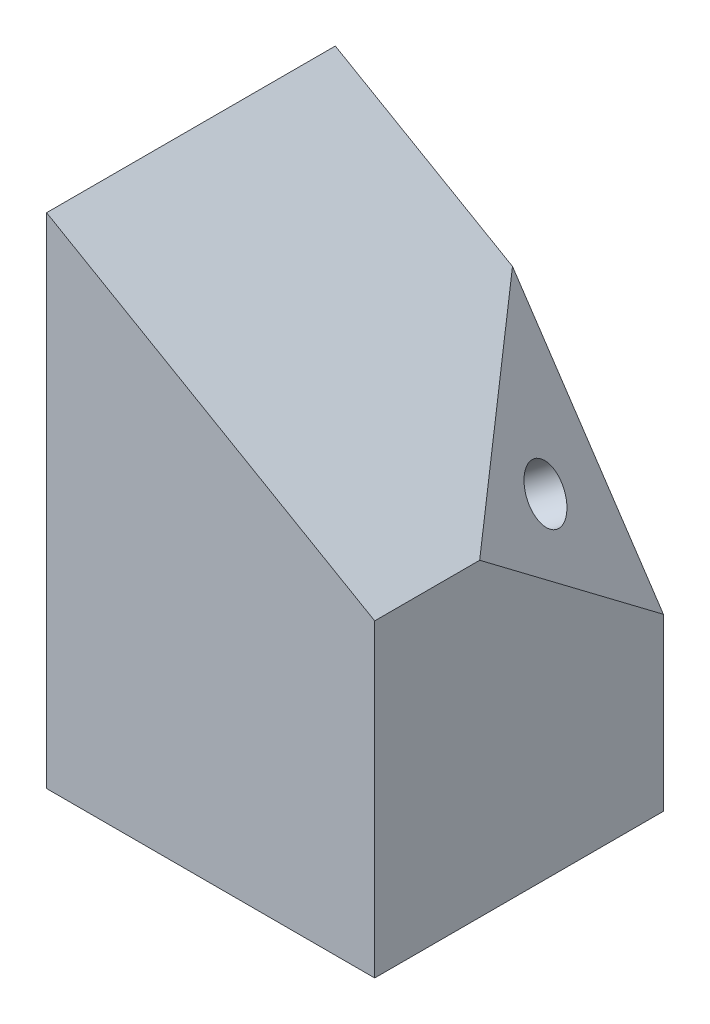
ISO-10303-21;
HEADER;
FILE_DESCRIPTION(('STEP AP214'),'2;1');
FILE_NAME('part.step','',(''),(''),'','','');
FILE_SCHEMA(('AUTOMOTIVE_DESIGN { 1 0 10303 214 1 1 1 1 }'));
ENDSEC;
DATA;
#1=APPLICATION_CONTEXT('core data for automotive mechanical design processes');
#2=APPLICATION_PROTOCOL_DEFINITION('international standard','automotive_design',2000,#1);
#3=PRODUCT_CONTEXT('',#1,'mechanical');
#4=PRODUCT('Part','Part','',(#3));
#5=PRODUCT_RELATED_PRODUCT_CATEGORY('part','',(#4));
#6=PRODUCT_DEFINITION_FORMATION('','',#4);
#7=PRODUCT_DEFINITION_CONTEXT('part definition',#1,'design');
#8=PRODUCT_DEFINITION('design','',#6,#7);
#9=PRODUCT_DEFINITION_SHAPE('','',#8);
#10=(LENGTH_UNIT() NAMED_UNIT(*) SI_UNIT(.MILLI.,.METRE.));
#11=(NAMED_UNIT(*) PLANE_ANGLE_UNIT() SI_UNIT($,.RADIAN.));
#12=(NAMED_UNIT(*) SI_UNIT($,.STERADIAN.) SOLID_ANGLE_UNIT());
#13=UNCERTAINTY_MEASURE_WITH_UNIT(LENGTH_MEASURE(1.E-05),#10,'distance_accuracy_value','');
#14=(GEOMETRIC_REPRESENTATION_CONTEXT(3) GLOBAL_UNCERTAINTY_ASSIGNED_CONTEXT((#13)) GLOBAL_UNIT_ASSIGNED_CONTEXT((#10,
#11,#12)) REPRESENTATION_CONTEXT('',''));
#15=CARTESIAN_POINT('',(0.,0.,0.));
#16=DIRECTION('',(0.,0.,1.));
#17=DIRECTION('',(1.,0.,0.));
#18=AXIS2_PLACEMENT_3D('',#15,#16,#17);
#19=CARTESIAN_POINT('',(-50.,76.,0.));
#20=DIRECTION('',(1.,0.,0.));
#21=DIRECTION('',(0.,0.,-1.));
#22=AXIS2_PLACEMENT_3D('',#19,#20,#21);
#23=PLANE('',#22);
#24=DIRECTION('',(0.,0.,1.));
#25=VECTOR('',#24,1.);
#26=CARTESIAN_POINT('',(-50.,0.,0.));
#27=LINE('',#26,#25);
#28=CARTESIAN_POINT('',(-50.,0.,-44.));
#29=VERTEX_POINT('',#28);
#30=CARTESIAN_POINT('',(-50.,0.,0.));
#31=VERTEX_POINT('',#30);
#32=EDGE_CURVE('E95',#29,#31,#27,.T.);
#33=ORIENTED_EDGE('',*,*,#32,.T.);
#34=DIRECTION('',(0.,-1.,0.));
#35=VECTOR('',#34,1.);
#36=CARTESIAN_POINT('',(-50.,76.,0.));
#37=LINE('',#36,#35);
#38=CARTESIAN_POINT('',(-50.,76.,0.));
#39=VERTEX_POINT('',#38);
#40=EDGE_CURVE('E11',#39,#31,#37,.T.);
#41=ORIENTED_EDGE('',*,*,#40,.F.);
#42=DIRECTION('',(0.,0.,1.));
#43=VECTOR('',#42,1.);
#44=CARTESIAN_POINT('',(-50.,76.,0.));
#45=LINE('',#44,#43);
#46=CARTESIAN_POINT('',(-50.,76.,-44.));
#47=VERTEX_POINT('',#46);
#48=EDGE_CURVE('E96',#47,#39,#45,.T.);
#49=ORIENTED_EDGE('',*,*,#48,.F.);
#50=DIRECTION('',(0.,-1.,0.));
#51=VECTOR('',#50,1.);
#52=CARTESIAN_POINT('',(-50.,76.,-44.));
#53=LINE('',#52,#51);
#54=EDGE_CURVE('E81',#47,#29,#53,.T.);
#55=ORIENTED_EDGE('',*,*,#54,.T.);
#56=EDGE_LOOP('',(#33,#41,#49,#55));
#57=FACE_BOUND('',#56,.T.);
#58=ADVANCED_FACE('F33',(#57),#23,.F.);
#59=CARTESIAN_POINT('',(-50.,76.,0.));
#60=DIRECTION('',(0.,0.,-1.));
#61=DIRECTION('',(-1.,0.,0.));
#62=AXIS2_PLACEMENT_3D('',#59,#60,#61);
#63=PLANE('',#62);
#64=DIRECTION('',(0.,-1.,0.));
#65=VECTOR('',#64,1.);
#66=CARTESIAN_POINT('',(0.,76.,0.));
#67=LINE('',#66,#65);
#68=CARTESIAN_POINT('',(0.,47.1324865405186,0.));
#69=VERTEX_POINT('',#68);
#70=CARTESIAN_POINT('',(0.,0.,0.));
#71=VERTEX_POINT('',#70);
#72=EDGE_CURVE('E40',#69,#71,#67,.T.);
#73=ORIENTED_EDGE('',*,*,#72,.F.);
#74=DIRECTION('',(0.866025403784438,-0.500000000000001,0.));
#75=VECTOR('',#74,1.);
#76=CARTESIAN_POINT('',(-50.,76.,0.));
#77=LINE('',#76,#75);
#78=EDGE_CURVE('E107',#39,#69,#77,.T.);
#79=ORIENTED_EDGE('',*,*,#78,.F.);
#80=ORIENTED_EDGE('',*,*,#40,.T.);
#81=DIRECTION('',(1.,0.,0.));
#82=VECTOR('',#81,1.);
#83=CARTESIAN_POINT('',(-50.,0.,0.));
#84=LINE('',#83,#82);
#85=EDGE_CURVE('E90',#31,#71,#84,.T.);
#86=ORIENTED_EDGE('',*,*,#85,.T.);
#87=EDGE_LOOP('',(#73,#79,#80,#86));
#88=FACE_BOUND('',#87,.T.);
#89=ADVANCED_FACE('F111',(#88),#63,.F.);
#90=CARTESIAN_POINT('',(0.,76.,0.));
#91=DIRECTION('',(-1.,0.,0.));
#92=DIRECTION('',(0.,0.,1.));
#93=AXIS2_PLACEMENT_3D('',#90,#91,#92);
#94=PLANE('',#93);
#95=DIRECTION('',(0.,-1.,0.));
#96=VECTOR('',#95,1.);
#97=CARTESIAN_POINT('',(0.,76.,-44.));
#98=LINE('',#97,#96);
#99=CARTESIAN_POINT('',(0.,26.,-44.));
#100=VERTEX_POINT('',#99);
#101=CARTESIAN_POINT('',(0.,0.,-44.));
#102=VERTEX_POINT('',#101);
#103=EDGE_CURVE('E72',#100,#102,#98,.T.);
#104=ORIENTED_EDGE('',*,*,#103,.F.);
#105=DIRECTION('',(0.,0.602414371591813,0.798183515803002));
#106=VECTOR('',#105,1.);
#107=CARTESIAN_POINT('',(0.,26.,-44.));
#108=LINE('',#107,#106);
#109=CARTESIAN_POINT('',(0.,47.1324865405186,-16.));
#110=VERTEX_POINT('',#109);
#111=EDGE_CURVE('E120',#100,#110,#108,.T.);
#112=ORIENTED_EDGE('',*,*,#111,.T.);
#113=DIRECTION('',(0.,0.,1.));
#114=VECTOR('',#113,1.);
#115=CARTESIAN_POINT('',(0.,47.1324865405186,-76.));
#116=LINE('',#115,#114);
#117=EDGE_CURVE('E104',#110,#69,#116,.T.);
#118=ORIENTED_EDGE('',*,*,#117,.T.);
#119=ORIENTED_EDGE('',*,*,#72,.T.);
#120=DIRECTION('',(0.,0.,-1.));
#121=VECTOR('',#120,1.);
#122=CARTESIAN_POINT('',(0.,0.,0.));
#123=LINE('',#122,#121);
#124=EDGE_CURVE('E84',#71,#102,#123,.T.);
#125=ORIENTED_EDGE('',*,*,#124,.T.);
#126=EDGE_LOOP('',(#104,#112,#118,#119,#125));
#127=FACE_BOUND('',#126,.T.);
#128=ADVANCED_FACE('F85',(#127),#94,.F.);
#129=CARTESIAN_POINT('',(-50.,76.,-44.));
#130=DIRECTION('',(0.,0.,1.));
#131=DIRECTION('',(1.,0.,0.));
#132=AXIS2_PLACEMENT_3D('',#129,#130,#131);
#133=PLANE('',#132);
#134=DIRECTION('',(0.866025403784438,-0.500000000000001,0.));
#135=VECTOR('',#134,1.);
#136=CARTESIAN_POINT('',(-50.,76.,-44.));
#137=LINE('',#136,#135);
#138=CARTESIAN_POINT('',(-23.,60.4115427318801,-44.));
#139=VERTEX_POINT('',#138);
#140=EDGE_CURVE('E55',#47,#139,#137,.T.);
#141=ORIENTED_EDGE('',*,*,#140,.T.);
#142=DIRECTION('',(0.555686184009288,-0.831392124632652,0.));
#143=VECTOR('',#142,1.);
#144=CARTESIAN_POINT('',(-23.,60.4115427318801,-44.));
#145=LINE('',#144,#143);
#146=EDGE_CURVE('E47',#139,#100,#145,.T.);
#147=ORIENTED_EDGE('',*,*,#146,.T.);
#148=ORIENTED_EDGE('',*,*,#103,.T.);
#149=DIRECTION('',(-1.,0.,0.));
#150=VECTOR('',#149,1.);
#151=CARTESIAN_POINT('',(-50.,0.,-44.));
#152=LINE('',#151,#150);
#153=EDGE_CURVE('E76',#102,#29,#152,.T.);
#154=ORIENTED_EDGE('',*,*,#153,.T.);
#155=ORIENTED_EDGE('',*,*,#54,.F.);
#156=EDGE_LOOP('',(#141,#147,#148,#154,#155));
#157=FACE_BOUND('',#156,.T.);
#158=ADVANCED_FACE('F74',(#157),#133,.F.);
#159=CARTESIAN_POINT('',(0.,0.,0.));
#160=DIRECTION('',(0.,-1.,0.));
#161=DIRECTION('',(0.,0.,-1.));
#162=AXIS2_PLACEMENT_3D('',#159,#160,#161);
#163=PLANE('',#162);
#164=ORIENTED_EDGE('',*,*,#32,.F.);
#165=ORIENTED_EDGE('',*,*,#153,.F.);
#166=ORIENTED_EDGE('',*,*,#124,.F.);
#167=ORIENTED_EDGE('',*,*,#85,.F.);
#168=EDGE_LOOP('',(#164,#165,#166,#167));
#169=FACE_BOUND('',#168,.T.);
#170=ADVANCED_FACE('F93',(#169),#163,.T.);
#171=CARTESIAN_POINT('',(-50.,76.,-76.));
#172=DIRECTION('',(-0.500000000000001,-0.866025403784438,0.));
#173=DIRECTION('',(0.866025403784438,-0.500000000000001,0.));
#174=AXIS2_PLACEMENT_3D('',#171,#172,#173);
#175=PLANE('',#174);
#176=ORIENTED_EDGE('',*,*,#117,.F.);
#177=DIRECTION('',(-0.59598026800957,0.344089368167032,-0.725541195837737));
#178=VECTOR('',#177,1.);
#179=CARTESIAN_POINT('',(0.,47.1324865405186,-16.));
#180=LINE('',#179,#178);
#181=EDGE_CURVE('E118',#110,#139,#180,.T.);
#182=ORIENTED_EDGE('',*,*,#181,.T.);
#183=ORIENTED_EDGE('',*,*,#140,.F.);
#184=ORIENTED_EDGE('',*,*,#48,.T.);
#185=ORIENTED_EDGE('',*,*,#78,.T.);
#186=EDGE_LOOP('',(#176,#182,#183,#184,#185));
#187=FACE_BOUND('',#186,.T.);
#188=ADVANCED_FACE('F125',(#187),#175,.F.);
#189=CARTESIAN_POINT('',(23.2621653949621,15.5479749412239,-11.7345489706334));
#190=DIRECTION('',(-0.76669444974503,-0.512443527496922,0.386757355271592));
#191=DIRECTION('',(0.555686184009289,-0.831392124632652,0.));
#192=AXIS2_PLACEMENT_3D('',#189,#190,#191);
#193=PLANE('',#192);
#194=CARTESIAN_POINT('',(-6.4871794871795,44.3755578127943,-32.5128205128205));
#195=DIRECTION('',(-0.76669444974503,-0.512443527496922,0.386757355271592));
#196=DIRECTION('',(0.555686184009288,-0.831392124632652,0.));
#197=AXIS2_PLACEMENT_3D('',#194,#195,#196);
#198=CIRCLE('',#197,4.00000000000001);
#199=CARTESIAN_POINT('',(-4.26443475114234,41.0499893142637,-32.5128205128205));
#200=VERTEX_POINT('',#199);
#201=EDGE_CURVE('E128',#200,#200,#198,.T.);
#202=ORIENTED_EDGE('',*,*,#201,.T.);
#203=EDGE_LOOP('',(#202));
#204=FACE_BOUND('',#203,.T.);
#205=ORIENTED_EDGE('',*,*,#111,.F.);
#206=ORIENTED_EDGE('',*,*,#146,.F.);
#207=ORIENTED_EDGE('',*,*,#181,.F.);
#208=EDGE_LOOP('',(#205,#206,#207));
#209=FACE_BOUND('',#208,.T.);
#210=ADVANCED_FACE('F119',(#204,#209),#193,.F.);
#211=CARTESIAN_POINT('',(-21.8210684820801,34.1266872628559,-24.7776734073887));
#212=DIRECTION('',(0.76669444974503,0.512443527496922,-0.386757355271592));
#213=DIRECTION('',(-0.555686184009288,0.831392124632652,0.));
#214=AXIS2_PLACEMENT_3D('',#211,#212,#213);
#215=CYLINDRICAL_SURFACE('',#214,4.00000000000001);
#216=CARTESIAN_POINT('',(-21.8210684820801,34.1266872628559,-24.7776734073887));
#217=DIRECTION('',(-0.76669444974503,-0.512443527496922,0.386757355271592));
#218=DIRECTION('',(0.555686184009288,-0.831392124632652,0.));
#219=AXIS2_PLACEMENT_3D('',#216,#217,#218);
#220=CIRCLE('',#219,4.00000000000001);
#221=CARTESIAN_POINT('',(-19.5983237460429,30.8011187643253,-24.7776734073887));
#222=VERTEX_POINT('',#221);
#223=EDGE_CURVE('E123',#222,#222,#220,.T.);
#224=ORIENTED_EDGE('',*,*,#223,.T.);
#225=EDGE_LOOP('',(#224));
#226=FACE_BOUND('',#225,.T.);
#227=ORIENTED_EDGE('',*,*,#201,.F.);
#228=EDGE_LOOP('',(#227));
#229=FACE_BOUND('',#228,.T.);
#230=ADVANCED_FACE('F134',(#226,#229),#215,.F.);
#231=CARTESIAN_POINT('',(-21.8210684820801,34.1266872628559,-24.7776734073887));
#232=DIRECTION('',(-0.76669444974503,-0.512443527496922,0.386757355271592));
#233=DIRECTION('',(0.555686184009288,-0.831392124632652,0.));
#234=AXIS2_PLACEMENT_3D('',#231,#232,#233);
#235=PLANE('',#234);
#236=ORIENTED_EDGE('',*,*,#223,.F.);
#237=EDGE_LOOP('',(#236));
#238=FACE_BOUND('',#237,.T.);
#239=ADVANCED_FACE('F137',(#238),#235,.F.);
#240=CLOSED_SHELL('',(#58,#89,#128,#158,#170,#188,#210,#230,#239));
#241=MANIFOLD_SOLID_BREP('B2',#240);
#242=ADVANCED_BREP_SHAPE_REPRESENTATION('',(#18,#241),#14);
#243=SHAPE_DEFINITION_REPRESENTATION(#9,#242);
ENDSEC;
END-ISO-10303-21;
